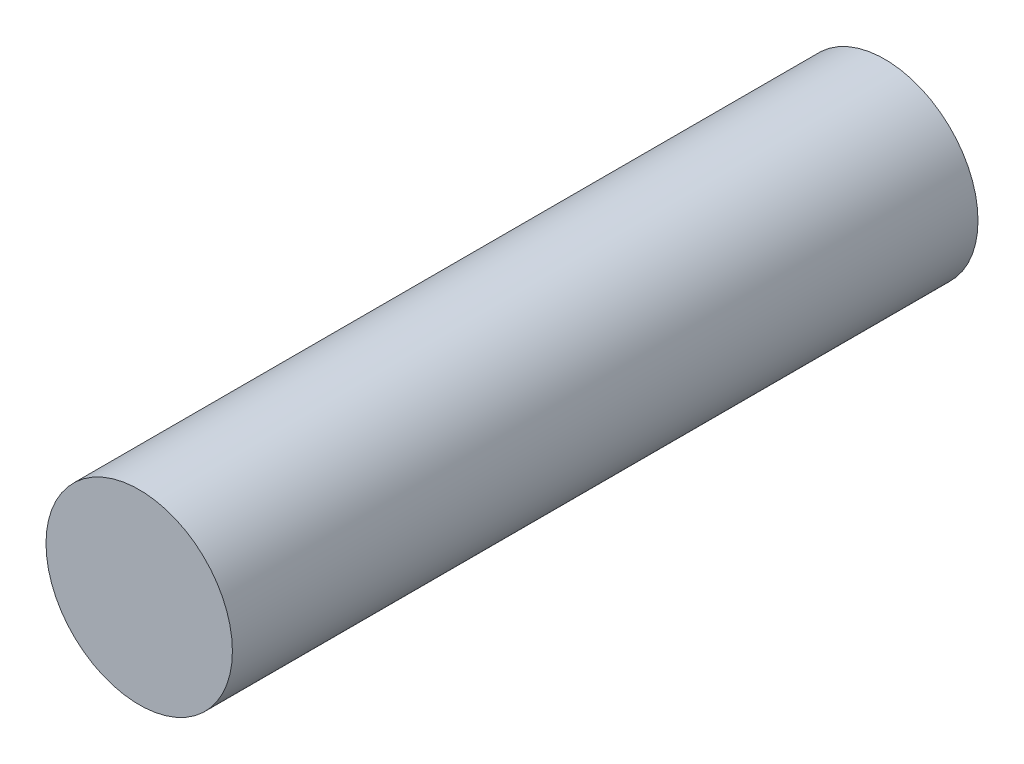
ISO-10303-21;
HEADER;
FILE_DESCRIPTION(('STEP AP214'),'2;1');
FILE_NAME('part.step','',(''),(''),'','','');
FILE_SCHEMA(('AUTOMOTIVE_DESIGN { 1 0 10303 214 1 1 1 1 }'));
ENDSEC;
DATA;
#1=APPLICATION_CONTEXT('core data for automotive mechanical design processes');
#2=APPLICATION_PROTOCOL_DEFINITION('international standard','automotive_design',2000,#1);
#3=PRODUCT_CONTEXT('',#1,'mechanical');
#4=PRODUCT('Part','Part','',(#3));
#5=PRODUCT_RELATED_PRODUCT_CATEGORY('part','',(#4));
#6=PRODUCT_DEFINITION_FORMATION('','',#4);
#7=PRODUCT_DEFINITION_CONTEXT('part definition',#1,'design');
#8=PRODUCT_DEFINITION('design','',#6,#7);
#9=PRODUCT_DEFINITION_SHAPE('','',#8);
#10=(LENGTH_UNIT() NAMED_UNIT(*) SI_UNIT(.MILLI.,.METRE.));
#11=(NAMED_UNIT(*) PLANE_ANGLE_UNIT() SI_UNIT($,.RADIAN.));
#12=(NAMED_UNIT(*) SI_UNIT($,.STERADIAN.) SOLID_ANGLE_UNIT());
#13=UNCERTAINTY_MEASURE_WITH_UNIT(LENGTH_MEASURE(1.E-05),#10,'distance_accuracy_value','');
#14=(GEOMETRIC_REPRESENTATION_CONTEXT(3) GLOBAL_UNCERTAINTY_ASSIGNED_CONTEXT((#13)) GLOBAL_UNIT_ASSIGNED_CONTEXT((#10,
#11,#12)) REPRESENTATION_CONTEXT('',''));
#15=CARTESIAN_POINT('',(0.,0.,0.));
#16=DIRECTION('',(0.,0.,1.));
#17=DIRECTION('',(1.,0.,0.));
#18=AXIS2_PLACEMENT_3D('',#15,#16,#17);
#19=CARTESIAN_POINT('',(0.,0.,-24.));
#20=DIRECTION('',(0.,0.,1.));
#21=DIRECTION('',(1.,0.,0.));
#22=AXIS2_PLACEMENT_3D('',#19,#20,#21);
#23=CYLINDRICAL_SURFACE('',#22,3.);
#24=CARTESIAN_POINT('',(0.,0.,-24.));
#25=DIRECTION('',(0.,0.,1.));
#26=DIRECTION('',(1.,0.,0.));
#27=AXIS2_PLACEMENT_3D('',#24,#25,#26);
#28=CIRCLE('',#27,3.);
#29=CARTESIAN_POINT('',(3.,0.,-24.));
#30=VERTEX_POINT('',#29);
#31=EDGE_CURVE('E10',#30,#30,#28,.T.);
#32=ORIENTED_EDGE('',*,*,#31,.T.);
#33=EDGE_LOOP('',(#32));
#34=FACE_BOUND('',#33,.T.);
#35=CARTESIAN_POINT('',(0.,0.,0.));
#36=DIRECTION('',(0.,0.,1.));
#37=DIRECTION('',(1.,0.,0.));
#38=AXIS2_PLACEMENT_3D('',#35,#36,#37);
#39=CIRCLE('',#38,3.);
#40=CARTESIAN_POINT('',(3.,0.,0.));
#41=VERTEX_POINT('',#40);
#42=EDGE_CURVE('E40',#41,#41,#39,.T.);
#43=ORIENTED_EDGE('',*,*,#42,.F.);
#44=EDGE_LOOP('',(#43));
#45=FACE_BOUND('',#44,.T.);
#46=ADVANCED_FACE('F37',(#34,#45),#23,.T.);
#47=CARTESIAN_POINT('',(0.,0.,-24.));
#48=DIRECTION('',(0.,0.,1.));
#49=DIRECTION('',(1.,0.,0.));
#50=AXIS2_PLACEMENT_3D('',#47,#48,#49);
#51=PLANE('',#50);
#52=ORIENTED_EDGE('',*,*,#31,.F.);
#53=EDGE_LOOP('',(#52));
#54=FACE_BOUND('',#53,.T.);
#55=ADVANCED_FACE('F54',(#54),#51,.F.);
#56=CARTESIAN_POINT('',(0.,0.,0.));
#57=DIRECTION('',(0.,0.,1.));
#58=DIRECTION('',(1.,0.,0.));
#59=AXIS2_PLACEMENT_3D('',#56,#57,#58);
#60=PLANE('',#59);
#61=ORIENTED_EDGE('',*,*,#42,.T.);
#62=EDGE_LOOP('',(#61));
#63=FACE_BOUND('',#62,.T.);
#64=ADVANCED_FACE('F51',(#63),#60,.T.);
#65=CLOSED_SHELL('',(#46,#55,#64));
#66=MANIFOLD_SOLID_BREP('B2',#65);
#67=ADVANCED_BREP_SHAPE_REPRESENTATION('',(#18,#66),#14);
#68=SHAPE_DEFINITION_REPRESENTATION(#9,#67);
ENDSEC;
END-ISO-10303-21;
